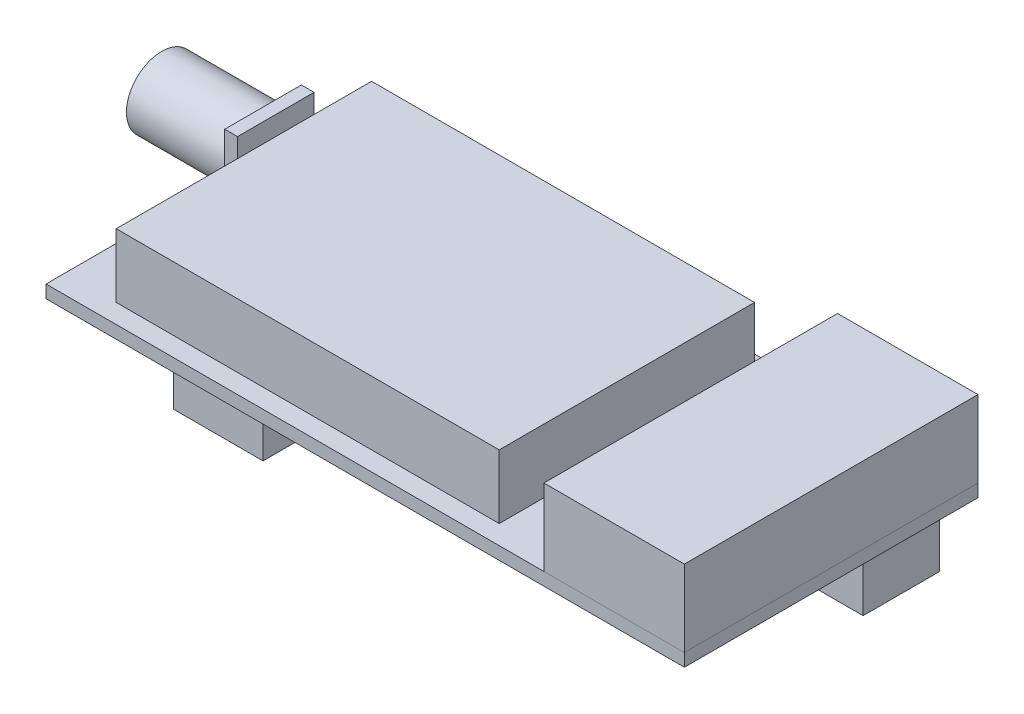
ISO-10303-21;
HEADER;
FILE_DESCRIPTION(('STEP AP214'),'2;1');
FILE_NAME('part.step','',(''),(''),'','','');
FILE_SCHEMA(('AUTOMOTIVE_DESIGN { 1 0 10303 214 1 1 1 1 }'));
ENDSEC;
DATA;
#1=APPLICATION_CONTEXT('core data for automotive mechanical design processes');
#2=APPLICATION_PROTOCOL_DEFINITION('international standard','automotive_design',2000,#1);
#3=PRODUCT_CONTEXT('',#1,'mechanical');
#4=PRODUCT('Part','Part','',(#3));
#5=PRODUCT_RELATED_PRODUCT_CATEGORY('part','',(#4));
#6=PRODUCT_DEFINITION_FORMATION('','',#4);
#7=PRODUCT_DEFINITION_CONTEXT('part definition',#1,'design');
#8=PRODUCT_DEFINITION('design','',#6,#7);
#9=PRODUCT_DEFINITION_SHAPE('','',#8);
#10=(LENGTH_UNIT() NAMED_UNIT(*) SI_UNIT(.MILLI.,.METRE.));
#11=(NAMED_UNIT(*) PLANE_ANGLE_UNIT() SI_UNIT($,.RADIAN.));
#12=(NAMED_UNIT(*) SI_UNIT($,.STERADIAN.) SOLID_ANGLE_UNIT());
#13=UNCERTAINTY_MEASURE_WITH_UNIT(LENGTH_MEASURE(1.E-05),#10,'distance_accuracy_value','');
#14=(GEOMETRIC_REPRESENTATION_CONTEXT(3) GLOBAL_UNCERTAINTY_ASSIGNED_CONTEXT((#13)) GLOBAL_UNIT_ASSIGNED_CONTEXT((#10,
#11,#12)) REPRESENTATION_CONTEXT('',''));
#15=CARTESIAN_POINT('',(0.,0.,0.));
#16=DIRECTION('',(0.,0.,1.));
#17=DIRECTION('',(1.,0.,0.));
#18=AXIS2_PLACEMENT_3D('',#15,#16,#17);
#19=CARTESIAN_POINT('',(14.,6.5,-11.5));
#20=DIRECTION('',(1.,0.,0.));
#21=DIRECTION('',(0.,0.,-1.));
#22=AXIS2_PLACEMENT_3D('',#19,#20,#21);
#23=PLANE('',#22);
#24=DIRECTION('',(0.,0.,1.));
#25=VECTOR('',#24,1.);
#26=CARTESIAN_POINT('',(14.,0.5,-11.5));
#27=LINE('',#26,#25);
#28=CARTESIAN_POINT('',(14.,0.5,-11.5));
#29=VERTEX_POINT('',#28);
#30=CARTESIAN_POINT('',(14.,0.5,11.5));
#31=VERTEX_POINT('',#30);
#32=EDGE_CURVE('E104',#29,#31,#27,.T.);
#33=ORIENTED_EDGE('',*,*,#32,.T.);
#34=DIRECTION('',(0.,-1.,0.));
#35=VECTOR('',#34,1.);
#36=CARTESIAN_POINT('',(14.,6.5,11.5));
#37=LINE('',#36,#35);
#38=CARTESIAN_POINT('',(14.,6.5,11.5));
#39=VERTEX_POINT('',#38);
#40=EDGE_CURVE('E12',#39,#31,#37,.T.);
#41=ORIENTED_EDGE('',*,*,#40,.F.);
#42=DIRECTION('',(0.,0.,1.));
#43=VECTOR('',#42,1.);
#44=CARTESIAN_POINT('',(14.,6.5,-11.5));
#45=LINE('',#44,#43);
#46=CARTESIAN_POINT('',(14.,6.5,-11.5));
#47=VERTEX_POINT('',#46);
#48=EDGE_CURVE('E92',#47,#39,#45,.T.);
#49=ORIENTED_EDGE('',*,*,#48,.F.);
#50=DIRECTION('',(0.,-1.,0.));
#51=VECTOR('',#50,1.);
#52=CARTESIAN_POINT('',(14.,6.5,-11.5));
#53=LINE('',#52,#51);
#54=EDGE_CURVE('E100',#47,#29,#53,.T.);
#55=ORIENTED_EDGE('',*,*,#54,.T.);
#56=EDGE_LOOP('',(#33,#41,#49,#55));
#57=FACE_BOUND('',#56,.T.);
#58=ADVANCED_FACE('F41',(#57),#23,.F.);
#59=CARTESIAN_POINT('',(14.,6.5,11.5));
#60=DIRECTION('',(0.,0.,-1.));
#61=DIRECTION('',(-1.,0.,0.));
#62=AXIS2_PLACEMENT_3D('',#59,#60,#61);
#63=PLANE('',#62);
#64=DIRECTION('',(1.,0.,0.));
#65=VECTOR('',#64,1.);
#66=CARTESIAN_POINT('',(14.,0.5,11.5));
#67=LINE('',#66,#65);
#68=CARTESIAN_POINT('',(25.,0.5,11.5));
#69=VERTEX_POINT('',#68);
#70=EDGE_CURVE('E96',#31,#69,#67,.T.);
#71=ORIENTED_EDGE('',*,*,#70,.T.);
#72=DIRECTION('',(0.,-1.,0.));
#73=VECTOR('',#72,1.);
#74=CARTESIAN_POINT('',(25.,6.5,11.5));
#75=LINE('',#74,#73);
#76=CARTESIAN_POINT('',(25.,6.5,11.5));
#77=VERTEX_POINT('',#76);
#78=EDGE_CURVE('E49',#77,#69,#75,.T.);
#79=ORIENTED_EDGE('',*,*,#78,.F.);
#80=DIRECTION('',(1.,0.,0.));
#81=VECTOR('',#80,1.);
#82=CARTESIAN_POINT('',(14.,6.5,11.5));
#83=LINE('',#82,#81);
#84=EDGE_CURVE('E87',#39,#77,#83,.T.);
#85=ORIENTED_EDGE('',*,*,#84,.F.);
#86=ORIENTED_EDGE('',*,*,#40,.T.);
#87=EDGE_LOOP('',(#71,#79,#85,#86));
#88=FACE_BOUND('',#87,.T.);
#89=ADVANCED_FACE('F95',(#88),#63,.F.);
#90=CARTESIAN_POINT('',(25.,6.5,-11.5));
#91=DIRECTION('',(-1.,0.,0.));
#92=DIRECTION('',(0.,0.,1.));
#93=AXIS2_PLACEMENT_3D('',#90,#91,#92);
#94=PLANE('',#93);
#95=DIRECTION('',(0.,0.,-1.));
#96=VECTOR('',#95,1.);
#97=CARTESIAN_POINT('',(25.,0.5,-11.5));
#98=LINE('',#97,#96);
#99=CARTESIAN_POINT('',(25.,0.5,-11.5));
#100=VERTEX_POINT('',#99);
#101=EDGE_CURVE('E74',#69,#100,#98,.T.);
#102=ORIENTED_EDGE('',*,*,#101,.T.);
#103=DIRECTION('',(0.,-1.,0.));
#104=VECTOR('',#103,1.);
#105=CARTESIAN_POINT('',(25.,6.5,-11.5));
#106=LINE('',#105,#104);
#107=CARTESIAN_POINT('',(25.,6.5,-11.5));
#108=VERTEX_POINT('',#107);
#109=EDGE_CURVE('E97',#108,#100,#106,.T.);
#110=ORIENTED_EDGE('',*,*,#109,.F.);
#111=DIRECTION('',(0.,0.,-1.));
#112=VECTOR('',#111,1.);
#113=CARTESIAN_POINT('',(25.,6.5,-11.5));
#114=LINE('',#113,#112);
#115=EDGE_CURVE('E90',#77,#108,#114,.T.);
#116=ORIENTED_EDGE('',*,*,#115,.F.);
#117=ORIENTED_EDGE('',*,*,#78,.T.);
#118=EDGE_LOOP('',(#102,#110,#116,#117));
#119=FACE_BOUND('',#118,.T.);
#120=ADVANCED_FACE('F98',(#119),#94,.F.);
#121=CARTESIAN_POINT('',(14.,6.5,-11.5));
#122=DIRECTION('',(0.,0.,1.));
#123=DIRECTION('',(1.,0.,0.));
#124=AXIS2_PLACEMENT_3D('',#121,#122,#123);
#125=PLANE('',#124);
#126=DIRECTION('',(-1.,0.,0.));
#127=VECTOR('',#126,1.);
#128=CARTESIAN_POINT('',(14.,0.5,-11.5));
#129=LINE('',#128,#127);
#130=EDGE_CURVE('E80',#100,#29,#129,.T.);
#131=ORIENTED_EDGE('',*,*,#130,.T.);
#132=ORIENTED_EDGE('',*,*,#54,.F.);
#133=DIRECTION('',(-1.,0.,0.));
#134=VECTOR('',#133,1.);
#135=CARTESIAN_POINT('',(14.,6.5,-11.5));
#136=LINE('',#135,#134);
#137=EDGE_CURVE('E57',#108,#47,#136,.T.);
#138=ORIENTED_EDGE('',*,*,#137,.F.);
#139=ORIENTED_EDGE('',*,*,#109,.T.);
#140=EDGE_LOOP('',(#131,#132,#138,#139));
#141=FACE_BOUND('',#140,.T.);
#142=ADVANCED_FACE('F111',(#141),#125,.F.);
#143=CARTESIAN_POINT('',(0.,6.5,0.));
#144=DIRECTION('',(0.,1.,0.));
#145=DIRECTION('',(0.,0.,1.));
#146=AXIS2_PLACEMENT_3D('',#143,#144,#145);
#147=PLANE('',#146);
#148=ORIENTED_EDGE('',*,*,#48,.T.);
#149=ORIENTED_EDGE('',*,*,#84,.T.);
#150=ORIENTED_EDGE('',*,*,#115,.T.);
#151=ORIENTED_EDGE('',*,*,#137,.T.);
#152=EDGE_LOOP('',(#148,#149,#150,#151));
#153=FACE_BOUND('',#152,.T.);
#154=ADVANCED_FACE('F88',(#153),#147,.T.);
#155=CARTESIAN_POINT('',(0.,0.5,0.));
#156=DIRECTION('',(0.,1.,0.));
#157=DIRECTION('',(0.,0.,1.));
#158=AXIS2_PLACEMENT_3D('',#155,#156,#157);
#159=PLANE('',#158);
#160=ORIENTED_EDGE('',*,*,#32,.F.);
#161=ORIENTED_EDGE('',*,*,#130,.F.);
#162=ORIENTED_EDGE('',*,*,#101,.F.);
#163=ORIENTED_EDGE('',*,*,#70,.F.);
#164=EDGE_LOOP('',(#160,#161,#162,#163));
#165=FACE_BOUND('',#164,.T.);
#166=ADVANCED_FACE('F114',(#165),#159,.F.);
#167=CLOSED_SHELL('',(#58,#89,#120,#142,#154,#166));
#168=MANIFOLD_SOLID_BREP('B2',#167);
#169=CARTESIAN_POINT('',(-34.,0.,-6.55283899782688));
#170=DIRECTION('',(1.,0.,0.));
#171=DIRECTION('',(0.,0.,-1.));
#172=AXIS2_PLACEMENT_3D('',#169,#170,#171);
#173=CYLINDRICAL_SURFACE('',#172,2.75);
#174=CARTESIAN_POINT('',(-34.,0.,-6.55283899782688));
#175=DIRECTION('',(-1.,0.,0.));
#176=DIRECTION('',(0.,0.,1.));
#177=AXIS2_PLACEMENT_3D('',#174,#175,#176);
#178=CIRCLE('',#177,2.75);
#179=CARTESIAN_POINT('',(-34.,0.,-3.80283899782688));
#180=VERTEX_POINT('',#179);
#181=EDGE_CURVE('E40',#180,#180,#178,.T.);
#182=ORIENTED_EDGE('',*,*,#181,.F.);
#183=EDGE_LOOP('',(#182));
#184=FACE_BOUND('',#183,.T.);
#185=CARTESIAN_POINT('',(-26.,0.,-6.55283899782688));
#186=DIRECTION('',(-1.,0.,0.));
#187=DIRECTION('',(0.,0.,1.));
#188=AXIS2_PLACEMENT_3D('',#185,#186,#187);
#189=CIRCLE('',#188,2.75);
#190=CARTESIAN_POINT('',(-26.,0.,-3.80283899782688));
#191=VERTEX_POINT('',#190);
#192=EDGE_CURVE('E177',#191,#191,#189,.T.);
#193=ORIENTED_EDGE('',*,*,#192,.T.);
#194=EDGE_LOOP('',(#193));
#195=FACE_BOUND('',#194,.T.);
#196=ADVANCED_FACE('F174',(#184,#195),#173,.T.);
#197=CARTESIAN_POINT('',(-34.,0.,-6.55283899782688));
#198=DIRECTION('',(-1.,0.,0.));
#199=DIRECTION('',(0.,0.,1.));
#200=AXIS2_PLACEMENT_3D('',#197,#198,#199);
#201=PLANE('',#200);
#202=ORIENTED_EDGE('',*,*,#181,.T.);
#203=EDGE_LOOP('',(#202));
#204=FACE_BOUND('',#203,.T.);
#205=ADVANCED_FACE('F189',(#204),#201,.T.);
#206=CARTESIAN_POINT('',(-26.,0.,-6.55283899782688));
#207=DIRECTION('',(-1.,0.,0.));
#208=DIRECTION('',(0.,0.,1.));
#209=AXIS2_PLACEMENT_3D('',#206,#207,#208);
#210=PLANE('',#209);
#211=ORIENTED_EDGE('',*,*,#192,.F.);
#212=EDGE_LOOP('',(#211));
#213=FACE_BOUND('',#212,.T.);
#214=ADVANCED_FACE('F187',(#213),#210,.F.);
#215=CLOSED_SHELL('',(#196,#205,#214));
#216=MANIFOLD_SOLID_BREP('B6',#215);
#217=CARTESIAN_POINT('',(-26.,3.,-9.49999999999999));
#218=DIRECTION('',(0.,0.,1.));
#219=DIRECTION('',(1.,0.,0.));
#220=AXIS2_PLACEMENT_3D('',#217,#218,#219);
#221=PLANE('',#220);
#222=DIRECTION('',(0.,-1.,0.));
#223=VECTOR('',#222,1.);
#224=CARTESIAN_POINT('',(-25.,3.,-9.49999999999999));
#225=LINE('',#224,#223);
#226=CARTESIAN_POINT('',(-25.,3.,-9.49999999999999));
#227=VERTEX_POINT('',#226);
#228=CARTESIAN_POINT('',(-25.,-3.,-9.49999999999999));
#229=VERTEX_POINT('',#228);
#230=EDGE_CURVE('E287',#227,#229,#225,.T.);
#231=ORIENTED_EDGE('',*,*,#230,.T.);
#232=DIRECTION('',(1.,0.,0.));
#233=VECTOR('',#232,1.);
#234=CARTESIAN_POINT('',(-26.,-3.,-9.49999999999999));
#235=LINE('',#234,#233);
#236=CARTESIAN_POINT('',(-26.,-3.,-9.49999999999999));
#237=VERTEX_POINT('',#236);
#238=EDGE_CURVE('E172',#237,#229,#235,.T.);
#239=ORIENTED_EDGE('',*,*,#238,.F.);
#240=DIRECTION('',(0.,-1.,0.));
#241=VECTOR('',#240,1.);
#242=CARTESIAN_POINT('',(-26.,3.,-9.49999999999999));
#243=LINE('',#242,#241);
#244=CARTESIAN_POINT('',(-26.,3.,-9.49999999999999));
#245=VERTEX_POINT('',#244);
#246=EDGE_CURVE('E275',#245,#237,#243,.T.);
#247=ORIENTED_EDGE('',*,*,#246,.F.);
#248=DIRECTION('',(1.,0.,0.));
#249=VECTOR('',#248,1.);
#250=CARTESIAN_POINT('',(-26.,3.,-9.49999999999999));
#251=LINE('',#250,#249);
#252=EDGE_CURVE('E283',#245,#227,#251,.T.);
#253=ORIENTED_EDGE('',*,*,#252,.T.);
#254=EDGE_LOOP('',(#231,#239,#247,#253));
#255=FACE_BOUND('',#254,.T.);
#256=ADVANCED_FACE('F224',(#255),#221,.F.);
#257=CARTESIAN_POINT('',(-26.,-3.,-9.49999999999999));
#258=DIRECTION('',(0.,1.,0.));
#259=DIRECTION('',(0.,0.,1.));
#260=AXIS2_PLACEMENT_3D('',#257,#258,#259);
#261=PLANE('',#260);
#262=DIRECTION('',(0.,0.,1.));
#263=VECTOR('',#262,1.);
#264=CARTESIAN_POINT('',(-25.,-3.,-9.49999999999999));
#265=LINE('',#264,#263);
#266=CARTESIAN_POINT('',(-25.,-3.,-3.49999999999999));
#267=VERTEX_POINT('',#266);
#268=EDGE_CURVE('E279',#229,#267,#265,.T.);
#269=ORIENTED_EDGE('',*,*,#268,.T.);
#270=DIRECTION('',(1.,0.,0.));
#271=VECTOR('',#270,1.);
#272=CARTESIAN_POINT('',(-26.,-3.,-3.49999999999999));
#273=LINE('',#272,#271);
#274=CARTESIAN_POINT('',(-26.,-3.,-3.49999999999999));
#275=VERTEX_POINT('',#274);
#276=EDGE_CURVE('E232',#275,#267,#273,.T.);
#277=ORIENTED_EDGE('',*,*,#276,.F.);
#278=DIRECTION('',(0.,0.,1.));
#279=VECTOR('',#278,1.);
#280=CARTESIAN_POINT('',(-26.,-3.,-9.49999999999999));
#281=LINE('',#280,#279);
#282=EDGE_CURVE('E270',#237,#275,#281,.T.);
#283=ORIENTED_EDGE('',*,*,#282,.F.);
#284=ORIENTED_EDGE('',*,*,#238,.T.);
#285=EDGE_LOOP('',(#269,#277,#283,#284));
#286=FACE_BOUND('',#285,.T.);
#287=ADVANCED_FACE('F278',(#286),#261,.F.);
#288=CARTESIAN_POINT('',(-26.,3.,-3.49999999999999));
#289=DIRECTION('',(0.,0.,-1.));
#290=DIRECTION('',(-1.,0.,0.));
#291=AXIS2_PLACEMENT_3D('',#288,#289,#290);
#292=PLANE('',#291);
#293=DIRECTION('',(0.,1.,0.));
#294=VECTOR('',#293,1.);
#295=CARTESIAN_POINT('',(-25.,3.,-3.49999999999999));
#296=LINE('',#295,#294);
#297=CARTESIAN_POINT('',(-25.,3.,-3.49999999999999));
#298=VERTEX_POINT('',#297);
#299=EDGE_CURVE('E257',#267,#298,#296,.T.);
#300=ORIENTED_EDGE('',*,*,#299,.T.);
#301=DIRECTION('',(1.,0.,0.));
#302=VECTOR('',#301,1.);
#303=CARTESIAN_POINT('',(-26.,3.,-3.49999999999999));
#304=LINE('',#303,#302);
#305=CARTESIAN_POINT('',(-26.,3.,-3.49999999999999));
#306=VERTEX_POINT('',#305);
#307=EDGE_CURVE('E280',#306,#298,#304,.T.);
#308=ORIENTED_EDGE('',*,*,#307,.F.);
#309=DIRECTION('',(0.,1.,0.));
#310=VECTOR('',#309,1.);
#311=CARTESIAN_POINT('',(-26.,3.,-3.49999999999999));
#312=LINE('',#311,#310);
#313=EDGE_CURVE('E273',#275,#306,#312,.T.);
#314=ORIENTED_EDGE('',*,*,#313,.F.);
#315=ORIENTED_EDGE('',*,*,#276,.T.);
#316=EDGE_LOOP('',(#300,#308,#314,#315));
#317=FACE_BOUND('',#316,.T.);
#318=ADVANCED_FACE('F281',(#317),#292,.F.);
#319=CARTESIAN_POINT('',(-26.,3.,-9.49999999999999));
#320=DIRECTION('',(0.,-1.,0.));
#321=DIRECTION('',(0.,0.,-1.));
#322=AXIS2_PLACEMENT_3D('',#319,#320,#321);
#323=PLANE('',#322);
#324=DIRECTION('',(0.,0.,-1.));
#325=VECTOR('',#324,1.);
#326=CARTESIAN_POINT('',(-25.,3.,-9.49999999999999));
#327=LINE('',#326,#325);
#328=EDGE_CURVE('E263',#298,#227,#327,.T.);
#329=ORIENTED_EDGE('',*,*,#328,.T.);
#330=ORIENTED_EDGE('',*,*,#252,.F.);
#331=DIRECTION('',(0.,0.,-1.));
#332=VECTOR('',#331,1.);
#333=CARTESIAN_POINT('',(-26.,3.,-9.49999999999999));
#334=LINE('',#333,#332);
#335=EDGE_CURVE('E240',#306,#245,#334,.T.);
#336=ORIENTED_EDGE('',*,*,#335,.F.);
#337=ORIENTED_EDGE('',*,*,#307,.T.);
#338=EDGE_LOOP('',(#329,#330,#336,#337));
#339=FACE_BOUND('',#338,.T.);
#340=ADVANCED_FACE('F294',(#339),#323,.F.);
#341=CARTESIAN_POINT('',(-26.,0.,0.));
#342=DIRECTION('',(-1.,0.,0.));
#343=DIRECTION('',(0.,0.,1.));
#344=AXIS2_PLACEMENT_3D('',#341,#342,#343);
#345=PLANE('',#344);
#346=ORIENTED_EDGE('',*,*,#246,.T.);
#347=ORIENTED_EDGE('',*,*,#282,.T.);
#348=ORIENTED_EDGE('',*,*,#313,.T.);
#349=ORIENTED_EDGE('',*,*,#335,.T.);
#350=EDGE_LOOP('',(#346,#347,#348,#349));
#351=FACE_BOUND('',#350,.T.);
#352=ADVANCED_FACE('F271',(#351),#345,.T.);
#353=CARTESIAN_POINT('',(-25.,0.,0.));
#354=DIRECTION('',(-1.,0.,0.));
#355=DIRECTION('',(0.,0.,1.));
#356=AXIS2_PLACEMENT_3D('',#353,#354,#355);
#357=PLANE('',#356);
#358=ORIENTED_EDGE('',*,*,#230,.F.);
#359=ORIENTED_EDGE('',*,*,#328,.F.);
#360=ORIENTED_EDGE('',*,*,#299,.F.);
#361=ORIENTED_EDGE('',*,*,#268,.F.);
#362=EDGE_LOOP('',(#358,#359,#360,#361));
#363=FACE_BOUND('',#362,.T.);
#364=ADVANCED_FACE('F297',(#363),#357,.F.);
#365=CLOSED_SHELL('',(#256,#287,#318,#340,#352,#364));
#366=MANIFOLD_SOLID_BREP('B35',#365);
#367=CARTESIAN_POINT('',(20.,-5.,-3.5));
#368=DIRECTION('',(1.,0.,0.));
#369=DIRECTION('',(0.,0.,-1.));
#370=AXIS2_PLACEMENT_3D('',#367,#368,#369);
#371=PLANE('',#370);
#372=DIRECTION('',(0.,0.,-1.));
#373=VECTOR('',#372,1.);
#374=CARTESIAN_POINT('',(20.,-0.5,-3.5));
#375=LINE('',#374,#373);
#376=CARTESIAN_POINT('',(20.,-0.5,-3.5));
#377=VERTEX_POINT('',#376);
#378=CARTESIAN_POINT('',(20.,-0.5,-9.5));
#379=VERTEX_POINT('',#378);
#380=EDGE_CURVE('E420',#377,#379,#375,.T.);
#381=ORIENTED_EDGE('',*,*,#380,.T.);
#382=DIRECTION('',(0.,1.,0.));
#383=VECTOR('',#382,1.);
#384=CARTESIAN_POINT('',(20.,-5.,-9.5));
#385=LINE('',#384,#383);
#386=CARTESIAN_POINT('',(20.,-5.,-9.5));
#387=VERTEX_POINT('',#386);
#388=EDGE_CURVE('E222',#387,#379,#385,.T.);
#389=ORIENTED_EDGE('',*,*,#388,.F.);
#390=DIRECTION('',(0.,0.,-1.));
#391=VECTOR('',#390,1.);
#392=CARTESIAN_POINT('',(20.,-5.,-3.5));
#393=LINE('',#392,#391);
#394=CARTESIAN_POINT('',(20.,-5.,-3.5));
#395=VERTEX_POINT('',#394);
#396=EDGE_CURVE('E408',#395,#387,#393,.T.);
#397=ORIENTED_EDGE('',*,*,#396,.F.);
#398=DIRECTION('',(0.,1.,0.));
#399=VECTOR('',#398,1.);
#400=CARTESIAN_POINT('',(20.,-5.,-3.5));
#401=LINE('',#400,#399);
#402=EDGE_CURVE('E416',#395,#377,#401,.T.);
#403=ORIENTED_EDGE('',*,*,#402,.T.);
#404=EDGE_LOOP('',(#381,#389,#397,#403));
#405=FACE_BOUND('',#404,.T.);
#406=ADVANCED_FACE('F357',(#405),#371,.F.);
#407=CARTESIAN_POINT('',(20.,-5.,-9.5));
#408=DIRECTION('',(0.,0.,1.));
#409=DIRECTION('',(1.,0.,0.));
#410=AXIS2_PLACEMENT_3D('',#407,#408,#409);
#411=PLANE('',#410);
#412=DIRECTION('',(1.,0.,0.));
#413=VECTOR('',#412,1.);
#414=CARTESIAN_POINT('',(20.,-0.5,-9.5));
#415=LINE('',#414,#413);
#416=CARTESIAN_POINT('',(24.,-0.5,-9.5));
#417=VERTEX_POINT('',#416);
#418=EDGE_CURVE('E412',#379,#417,#415,.T.);
#419=ORIENTED_EDGE('',*,*,#418,.T.);
#420=DIRECTION('',(0.,1.,0.));
#421=VECTOR('',#420,1.);
#422=CARTESIAN_POINT('',(24.,-5.,-9.5));
#423=LINE('',#422,#421);
#424=CARTESIAN_POINT('',(24.,-5.,-9.5));
#425=VERTEX_POINT('',#424);
#426=EDGE_CURVE('E365',#425,#417,#423,.T.);
#427=ORIENTED_EDGE('',*,*,#426,.F.);
#428=DIRECTION('',(1.,0.,0.));
#429=VECTOR('',#428,1.);
#430=CARTESIAN_POINT('',(20.,-5.,-9.5));
#431=LINE('',#430,#429);
#432=EDGE_CURVE('E403',#387,#425,#431,.T.);
#433=ORIENTED_EDGE('',*,*,#432,.F.);
#434=ORIENTED_EDGE('',*,*,#388,.T.);
#435=EDGE_LOOP('',(#419,#427,#433,#434));
#436=FACE_BOUND('',#435,.T.);
#437=ADVANCED_FACE('F411',(#436),#411,.F.);
#438=CARTESIAN_POINT('',(24.,-5.,-3.5));
#439=DIRECTION('',(-1.,0.,0.));
#440=DIRECTION('',(0.,0.,1.));
#441=AXIS2_PLACEMENT_3D('',#438,#439,#440);
#442=PLANE('',#441);
#443=DIRECTION('',(0.,0.,1.));
#444=VECTOR('',#443,1.);
#445=CARTESIAN_POINT('',(24.,-0.5,-3.5));
#446=LINE('',#445,#444);
#447=CARTESIAN_POINT('',(24.,-0.5,-3.5));
#448=VERTEX_POINT('',#447);
#449=EDGE_CURVE('E390',#417,#448,#446,.T.);
#450=ORIENTED_EDGE('',*,*,#449,.T.);
#451=DIRECTION('',(0.,1.,0.));
#452=VECTOR('',#451,1.);
#453=CARTESIAN_POINT('',(24.,-5.,-3.5));
#454=LINE('',#453,#452);
#455=CARTESIAN_POINT('',(24.,-5.,-3.5));
#456=VERTEX_POINT('',#455);
#457=EDGE_CURVE('E413',#456,#448,#454,.T.);
#458=ORIENTED_EDGE('',*,*,#457,.F.);
#459=DIRECTION('',(0.,0.,1.));
#460=VECTOR('',#459,1.);
#461=CARTESIAN_POINT('',(24.,-5.,-3.5));
#462=LINE('',#461,#460);
#463=EDGE_CURVE('E406',#425,#456,#462,.T.);
#464=ORIENTED_EDGE('',*,*,#463,.F.);
#465=ORIENTED_EDGE('',*,*,#426,.T.);
#466=EDGE_LOOP('',(#450,#458,#464,#465));
#467=FACE_BOUND('',#466,.T.);
#468=ADVANCED_FACE('F414',(#467),#442,.F.);
#469=CARTESIAN_POINT('',(20.,-5.,-3.5));
#470=DIRECTION('',(0.,0.,-1.));
#471=DIRECTION('',(-1.,0.,0.));
#472=AXIS2_PLACEMENT_3D('',#469,#470,#471);
#473=PLANE('',#472);
#474=DIRECTION('',(-1.,0.,0.));
#475=VECTOR('',#474,1.);
#476=CARTESIAN_POINT('',(20.,-0.5,-3.5));
#477=LINE('',#476,#475);
#478=EDGE_CURVE('E396',#448,#377,#477,.T.);
#479=ORIENTED_EDGE('',*,*,#478,.T.);
#480=ORIENTED_EDGE('',*,*,#402,.F.);
#481=DIRECTION('',(-1.,0.,0.));
#482=VECTOR('',#481,1.);
#483=CARTESIAN_POINT('',(20.,-5.,-3.5));
#484=LINE('',#483,#482);
#485=EDGE_CURVE('E373',#456,#395,#484,.T.);
#486=ORIENTED_EDGE('',*,*,#485,.F.);
#487=ORIENTED_EDGE('',*,*,#457,.T.);
#488=EDGE_LOOP('',(#479,#480,#486,#487));
#489=FACE_BOUND('',#488,.T.);
#490=ADVANCED_FACE('F427',(#489),#473,.F.);
#491=CARTESIAN_POINT('',(0.,-5.,0.));
#492=DIRECTION('',(0.,-1.,0.));
#493=DIRECTION('',(0.,0.,-1.));
#494=AXIS2_PLACEMENT_3D('',#491,#492,#493);
#495=PLANE('',#494);
#496=ORIENTED_EDGE('',*,*,#396,.T.);
#497=ORIENTED_EDGE('',*,*,#432,.T.);
#498=ORIENTED_EDGE('',*,*,#463,.T.);
#499=ORIENTED_EDGE('',*,*,#485,.T.);
#500=EDGE_LOOP('',(#496,#497,#498,#499));
#501=FACE_BOUND('',#500,.T.);
#502=ADVANCED_FACE('F404',(#501),#495,.T.);
#503=CARTESIAN_POINT('',(0.,-0.5,0.));
#504=DIRECTION('',(0.,-1.,0.));
#505=DIRECTION('',(0.,0.,-1.));
#506=AXIS2_PLACEMENT_3D('',#503,#504,#505);
#507=PLANE('',#506);
#508=ORIENTED_EDGE('',*,*,#380,.F.);
#509=ORIENTED_EDGE('',*,*,#478,.F.);
#510=ORIENTED_EDGE('',*,*,#449,.F.);
#511=ORIENTED_EDGE('',*,*,#418,.F.);
#512=EDGE_LOOP('',(#508,#509,#510,#511));
#513=FACE_BOUND('',#512,.T.);
#514=ADVANCED_FACE('F430',(#513),#507,.F.);
#515=CLOSED_SHELL('',(#406,#437,#468,#490,#502,#514));
#516=MANIFOLD_SOLID_BREP('B166',#515);
#517=CARTESIAN_POINT('',(-17.,-5.,9.50000000000001));
#518=DIRECTION('',(1.,0.,0.));
#519=DIRECTION('',(0.,0.,-1.));
#520=AXIS2_PLACEMENT_3D('',#517,#518,#519);
#521=PLANE('',#520);
#522=DIRECTION('',(0.,0.,-1.));
#523=VECTOR('',#522,1.);
#524=CARTESIAN_POINT('',(-17.,-0.5,9.50000000000001));
#525=LINE('',#524,#523);
#526=CARTESIAN_POINT('',(-17.,-0.5,9.50000000000001));
#527=VERTEX_POINT('',#526);
#528=CARTESIAN_POINT('',(-17.,-0.5,2.50000000000001));
#529=VERTEX_POINT('',#528);
#530=EDGE_CURVE('E553',#527,#529,#525,.T.);
#531=ORIENTED_EDGE('',*,*,#530,.T.);
#532=DIRECTION('',(0.,1.,0.));
#533=VECTOR('',#532,1.);
#534=CARTESIAN_POINT('',(-17.,-5.,2.50000000000001));
#535=LINE('',#534,#533);
#536=CARTESIAN_POINT('',(-17.,-5.,2.50000000000001));
#537=VERTEX_POINT('',#536);
#538=EDGE_CURVE('E355',#537,#529,#535,.T.);
#539=ORIENTED_EDGE('',*,*,#538,.F.);
#540=DIRECTION('',(0.,0.,-1.));
#541=VECTOR('',#540,1.);
#542=CARTESIAN_POINT('',(-17.,-5.,9.50000000000001));
#543=LINE('',#542,#541);
#544=CARTESIAN_POINT('',(-17.,-5.,9.50000000000001));
#545=VERTEX_POINT('',#544);
#546=EDGE_CURVE('E541',#545,#537,#543,.T.);
#547=ORIENTED_EDGE('',*,*,#546,.F.);
#548=DIRECTION('',(0.,1.,0.));
#549=VECTOR('',#548,1.);
#550=CARTESIAN_POINT('',(-17.,-5.,9.50000000000001));
#551=LINE('',#550,#549);
#552=EDGE_CURVE('E549',#545,#527,#551,.T.);
#553=ORIENTED_EDGE('',*,*,#552,.T.);
#554=EDGE_LOOP('',(#531,#539,#547,#553));
#555=FACE_BOUND('',#554,.T.);
#556=ADVANCED_FACE('F490',(#555),#521,.F.);
#557=CARTESIAN_POINT('',(-17.,-5.,2.50000000000001));
#558=DIRECTION('',(0.,0.,1.));
#559=DIRECTION('',(1.,0.,0.));
#560=AXIS2_PLACEMENT_3D('',#557,#558,#559);
#561=PLANE('',#560);
#562=DIRECTION('',(1.,0.,0.));
#563=VECTOR('',#562,1.);
#564=CARTESIAN_POINT('',(-17.,-0.5,2.50000000000001));
#565=LINE('',#564,#563);
#566=CARTESIAN_POINT('',(-10.,-0.5,2.50000000000001));
#567=VERTEX_POINT('',#566);
#568=EDGE_CURVE('E545',#529,#567,#565,.T.);
#569=ORIENTED_EDGE('',*,*,#568,.T.);
#570=DIRECTION('',(0.,1.,0.));
#571=VECTOR('',#570,1.);
#572=CARTESIAN_POINT('',(-10.,-5.,2.50000000000001));
#573=LINE('',#572,#571);
#574=CARTESIAN_POINT('',(-10.,-5.,2.50000000000001));
#575=VERTEX_POINT('',#574);
#576=EDGE_CURVE('E498',#575,#567,#573,.T.);
#577=ORIENTED_EDGE('',*,*,#576,.F.);
#578=DIRECTION('',(1.,0.,0.));
#579=VECTOR('',#578,1.);
#580=CARTESIAN_POINT('',(-17.,-5.,2.50000000000001));
#581=LINE('',#580,#579);
#582=EDGE_CURVE('E536',#537,#575,#581,.T.);
#583=ORIENTED_EDGE('',*,*,#582,.F.);
#584=ORIENTED_EDGE('',*,*,#538,.T.);
#585=EDGE_LOOP('',(#569,#577,#583,#584));
#586=FACE_BOUND('',#585,.T.);
#587=ADVANCED_FACE('F544',(#586),#561,.F.);
#588=CARTESIAN_POINT('',(-10.,-5.,9.50000000000001));
#589=DIRECTION('',(-1.,0.,0.));
#590=DIRECTION('',(0.,0.,1.));
#591=AXIS2_PLACEMENT_3D('',#588,#589,#590);
#592=PLANE('',#591);
#593=DIRECTION('',(0.,0.,1.));
#594=VECTOR('',#593,1.);
#595=CARTESIAN_POINT('',(-10.,-0.5,9.50000000000001));
#596=LINE('',#595,#594);
#597=CARTESIAN_POINT('',(-10.,-0.5,9.50000000000001));
#598=VERTEX_POINT('',#597);
#599=EDGE_CURVE('E523',#567,#598,#596,.T.);
#600=ORIENTED_EDGE('',*,*,#599,.T.);
#601=DIRECTION('',(0.,1.,0.));
#602=VECTOR('',#601,1.);
#603=CARTESIAN_POINT('',(-10.,-5.,9.50000000000001));
#604=LINE('',#603,#602);
#605=CARTESIAN_POINT('',(-10.,-5.,9.50000000000001));
#606=VERTEX_POINT('',#605);
#607=EDGE_CURVE('E546',#606,#598,#604,.T.);
#608=ORIENTED_EDGE('',*,*,#607,.F.);
#609=DIRECTION('',(0.,0.,1.));
#610=VECTOR('',#609,1.);
#611=CARTESIAN_POINT('',(-10.,-5.,9.50000000000001));
#612=LINE('',#611,#610);
#613=EDGE_CURVE('E539',#575,#606,#612,.T.);
#614=ORIENTED_EDGE('',*,*,#613,.F.);
#615=ORIENTED_EDGE('',*,*,#576,.T.);
#616=EDGE_LOOP('',(#600,#608,#614,#615));
#617=FACE_BOUND('',#616,.T.);
#618=ADVANCED_FACE('F547',(#617),#592,.F.);
#619=CARTESIAN_POINT('',(-17.,-5.,9.50000000000001));
#620=DIRECTION('',(0.,0.,-1.));
#621=DIRECTION('',(-1.,0.,0.));
#622=AXIS2_PLACEMENT_3D('',#619,#620,#621);
#623=PLANE('',#622);
#624=DIRECTION('',(-1.,0.,0.));
#625=VECTOR('',#624,1.);
#626=CARTESIAN_POINT('',(-17.,-0.5,9.50000000000001));
#627=LINE('',#626,#625);
#628=EDGE_CURVE('E529',#598,#527,#627,.T.);
#629=ORIENTED_EDGE('',*,*,#628,.T.);
#630=ORIENTED_EDGE('',*,*,#552,.F.);
#631=DIRECTION('',(-1.,0.,0.));
#632=VECTOR('',#631,1.);
#633=CARTESIAN_POINT('',(-17.,-5.,9.50000000000001));
#634=LINE('',#633,#632);
#635=EDGE_CURVE('E506',#606,#545,#634,.T.);
#636=ORIENTED_EDGE('',*,*,#635,.F.);
#637=ORIENTED_EDGE('',*,*,#607,.T.);
#638=EDGE_LOOP('',(#629,#630,#636,#637));
#639=FACE_BOUND('',#638,.T.);
#640=ADVANCED_FACE('F560',(#639),#623,.F.);
#641=CARTESIAN_POINT('',(0.,-5.,0.));
#642=DIRECTION('',(0.,-1.,0.));
#643=DIRECTION('',(0.,0.,-1.));
#644=AXIS2_PLACEMENT_3D('',#641,#642,#643);
#645=PLANE('',#644);
#646=ORIENTED_EDGE('',*,*,#546,.T.);
#647=ORIENTED_EDGE('',*,*,#582,.T.);
#648=ORIENTED_EDGE('',*,*,#613,.T.);
#649=ORIENTED_EDGE('',*,*,#635,.T.);
#650=EDGE_LOOP('',(#646,#647,#648,#649));
#651=FACE_BOUND('',#650,.T.);
#652=ADVANCED_FACE('F537',(#651),#645,.T.);
#653=CARTESIAN_POINT('',(0.,-0.5,0.));
#654=DIRECTION('',(0.,-1.,0.));
#655=DIRECTION('',(0.,0.,-1.));
#656=AXIS2_PLACEMENT_3D('',#653,#654,#655);
#657=PLANE('',#656);
#658=ORIENTED_EDGE('',*,*,#530,.F.);
#659=ORIENTED_EDGE('',*,*,#628,.F.);
#660=ORIENTED_EDGE('',*,*,#599,.F.);
#661=ORIENTED_EDGE('',*,*,#568,.F.);
#662=EDGE_LOOP('',(#658,#659,#660,#661));
#663=FACE_BOUND('',#662,.T.);
#664=ADVANCED_FACE('F563',(#663),#657,.F.);
#665=CLOSED_SHELL('',(#556,#587,#618,#640,#652,#664));
#666=MANIFOLD_SOLID_BREP('B216',#665);
#667=CARTESIAN_POINT('',(-21.,5.5,-10.));
#668=DIRECTION('',(1.,0.,0.));
#669=DIRECTION('',(0.,0.,-1.));
#670=AXIS2_PLACEMENT_3D('',#667,#668,#669);
#671=PLANE('',#670);
#672=DIRECTION('',(0.,0.,1.));
#673=VECTOR('',#672,1.);
#674=CARTESIAN_POINT('',(-21.,0.5,-10.));
#675=LINE('',#674,#673);
#676=CARTESIAN_POINT('',(-21.,0.5,-10.));
#677=VERTEX_POINT('',#676);
#678=CARTESIAN_POINT('',(-21.,0.5,10.));
#679=VERTEX_POINT('',#678);
#680=EDGE_CURVE('E685',#677,#679,#675,.T.);
#681=ORIENTED_EDGE('',*,*,#680,.T.);
#682=DIRECTION('',(0.,-1.,0.));
#683=VECTOR('',#682,1.);
#684=CARTESIAN_POINT('',(-21.,5.5,10.));
#685=LINE('',#684,#683);
#686=CARTESIAN_POINT('',(-21.,5.5,10.));
#687=VERTEX_POINT('',#686);
#688=EDGE_CURVE('E488',#687,#679,#685,.T.);
#689=ORIENTED_EDGE('',*,*,#688,.F.);
#690=DIRECTION('',(0.,0.,1.));
#691=VECTOR('',#690,1.);
#692=CARTESIAN_POINT('',(-21.,5.5,-10.));
#693=LINE('',#692,#691);
#694=CARTESIAN_POINT('',(-21.,5.5,-10.));
#695=VERTEX_POINT('',#694);
#696=EDGE_CURVE('E673',#695,#687,#693,.T.);
#697=ORIENTED_EDGE('',*,*,#696,.F.);
#698=DIRECTION('',(0.,-1.,0.));
#699=VECTOR('',#698,1.);
#700=CARTESIAN_POINT('',(-21.,5.5,-10.));
#701=LINE('',#700,#699);
#702=EDGE_CURVE('E681',#695,#677,#701,.T.);
#703=ORIENTED_EDGE('',*,*,#702,.T.);
#704=EDGE_LOOP('',(#681,#689,#697,#703));
#705=FACE_BOUND('',#704,.T.);
#706=ADVANCED_FACE('F622',(#705),#671,.F.);
#707=CARTESIAN_POINT('',(-21.,5.5,10.));
#708=DIRECTION('',(0.,0.,-1.));
#709=DIRECTION('',(-1.,0.,0.));
#710=AXIS2_PLACEMENT_3D('',#707,#708,#709);
#711=PLANE('',#710);
#712=DIRECTION('',(1.,0.,0.));
#713=VECTOR('',#712,1.);
#714=CARTESIAN_POINT('',(-21.,0.5,10.));
#715=LINE('',#714,#713);
#716=CARTESIAN_POINT('',(9.,0.5,9.99999999999999));
#717=VERTEX_POINT('',#716);
#718=EDGE_CURVE('E677',#679,#717,#715,.T.);
#719=ORIENTED_EDGE('',*,*,#718,.T.);
#720=DIRECTION('',(0.,-1.,0.));
#721=VECTOR('',#720,1.);
#722=CARTESIAN_POINT('',(9.,5.5,9.99999999999999));
#723=LINE('',#722,#721);
#724=CARTESIAN_POINT('',(9.,5.5,9.99999999999999));
#725=VERTEX_POINT('',#724);
#726=EDGE_CURVE('E630',#725,#717,#723,.T.);
#727=ORIENTED_EDGE('',*,*,#726,.F.);
#728=DIRECTION('',(1.,0.,0.));
#729=VECTOR('',#728,1.);
#730=CARTESIAN_POINT('',(-21.,5.5,10.));
#731=LINE('',#730,#729);
#732=EDGE_CURVE('E668',#687,#725,#731,.T.);
#733=ORIENTED_EDGE('',*,*,#732,.F.);
#734=ORIENTED_EDGE('',*,*,#688,.T.);
#735=EDGE_LOOP('',(#719,#727,#733,#734));
#736=FACE_BOUND('',#735,.T.);
#737=ADVANCED_FACE('F676',(#736),#711,.F.);
#738=CARTESIAN_POINT('',(8.99999999999999,5.5,-10.));
#739=DIRECTION('',(-1.,0.,0.));
#740=DIRECTION('',(0.,0.,1.));
#741=AXIS2_PLACEMENT_3D('',#738,#739,#740);
#742=PLANE('',#741);
#743=DIRECTION('',(0.,0.,-1.));
#744=VECTOR('',#743,1.);
#745=CARTESIAN_POINT('',(8.99999999999999,0.5,-10.));
#746=LINE('',#745,#744);
#747=CARTESIAN_POINT('',(8.99999999999999,0.5,-10.));
#748=VERTEX_POINT('',#747);
#749=EDGE_CURVE('E655',#717,#748,#746,.T.);
#750=ORIENTED_EDGE('',*,*,#749,.T.);
#751=DIRECTION('',(0.,-1.,0.));
#752=VECTOR('',#751,1.);
#753=CARTESIAN_POINT('',(8.99999999999999,5.5,-10.));
#754=LINE('',#753,#752);
#755=CARTESIAN_POINT('',(8.99999999999999,5.5,-10.));
#756=VERTEX_POINT('',#755);
#757=EDGE_CURVE('E678',#756,#748,#754,.T.);
#758=ORIENTED_EDGE('',*,*,#757,.F.);
#759=DIRECTION('',(0.,0.,-1.));
#760=VECTOR('',#759,1.);
#761=CARTESIAN_POINT('',(8.99999999999999,5.5,-10.));
#762=LINE('',#761,#760);
#763=EDGE_CURVE('E671',#725,#756,#762,.T.);
#764=ORIENTED_EDGE('',*,*,#763,.F.);
#765=ORIENTED_EDGE('',*,*,#726,.T.);
#766=EDGE_LOOP('',(#750,#758,#764,#765));
#767=FACE_BOUND('',#766,.T.);
#768=ADVANCED_FACE('F679',(#767),#742,.F.);
#769=CARTESIAN_POINT('',(-21.,5.5,-10.));
#770=DIRECTION('',(0.,0.,1.));
#771=DIRECTION('',(1.,0.,0.));
#772=AXIS2_PLACEMENT_3D('',#769,#770,#771);
#773=PLANE('',#772);
#774=DIRECTION('',(-1.,0.,0.));
#775=VECTOR('',#774,1.);
#776=CARTESIAN_POINT('',(-21.,0.5,-10.));
#777=LINE('',#776,#775);
#778=EDGE_CURVE('E661',#748,#677,#777,.T.);
#779=ORIENTED_EDGE('',*,*,#778,.T.);
#780=ORIENTED_EDGE('',*,*,#702,.F.);
#781=DIRECTION('',(-1.,0.,0.));
#782=VECTOR('',#781,1.);
#783=CARTESIAN_POINT('',(-21.,5.5,-10.));
#784=LINE('',#783,#782);
#785=EDGE_CURVE('E638',#756,#695,#784,.T.);
#786=ORIENTED_EDGE('',*,*,#785,.F.);
#787=ORIENTED_EDGE('',*,*,#757,.T.);
#788=EDGE_LOOP('',(#779,#780,#786,#787));
#789=FACE_BOUND('',#788,.T.);
#790=ADVANCED_FACE('F692',(#789),#773,.F.);
#791=CARTESIAN_POINT('',(0.,5.5,0.));
#792=DIRECTION('',(0.,1.,0.));
#793=DIRECTION('',(0.,0.,1.));
#794=AXIS2_PLACEMENT_3D('',#791,#792,#793);
#795=PLANE('',#794);
#796=ORIENTED_EDGE('',*,*,#696,.T.);
#797=ORIENTED_EDGE('',*,*,#732,.T.);
#798=ORIENTED_EDGE('',*,*,#763,.T.);
#799=ORIENTED_EDGE('',*,*,#785,.T.);
#800=EDGE_LOOP('',(#796,#797,#798,#799));
#801=FACE_BOUND('',#800,.T.);
#802=ADVANCED_FACE('F669',(#801),#795,.T.);
#803=CARTESIAN_POINT('',(0.,0.5,0.));
#804=DIRECTION('',(0.,1.,0.));
#805=DIRECTION('',(0.,0.,1.));
#806=AXIS2_PLACEMENT_3D('',#803,#804,#805);
#807=PLANE('',#806);
#808=ORIENTED_EDGE('',*,*,#680,.F.);
#809=ORIENTED_EDGE('',*,*,#778,.F.);
#810=ORIENTED_EDGE('',*,*,#749,.F.);
#811=ORIENTED_EDGE('',*,*,#718,.F.);
#812=EDGE_LOOP('',(#808,#809,#810,#811));
#813=FACE_BOUND('',#812,.T.);
#814=ADVANCED_FACE('F695',(#813),#807,.F.);
#815=CLOSED_SHELL('',(#706,#737,#768,#790,#802,#814));
#816=MANIFOLD_SOLID_BREP('B349',#815);
#817=CARTESIAN_POINT('',(-25.,0.5,-11.5));
#818=DIRECTION('',(1.,0.,0.));
#819=DIRECTION('',(0.,0.,-1.));
#820=AXIS2_PLACEMENT_3D('',#817,#818,#819);
#821=PLANE('',#820);
#822=DIRECTION('',(0.,0.,1.));
#823=VECTOR('',#822,1.);
#824=CARTESIAN_POINT('',(-25.,-0.5,-11.5));
#825=LINE('',#824,#823);
#826=CARTESIAN_POINT('',(-25.,-0.5,-11.5));
#827=VERTEX_POINT('',#826);
#828=CARTESIAN_POINT('',(-25.,-0.5,11.5));
#829=VERTEX_POINT('',#828);
#830=EDGE_CURVE('E808',#827,#829,#825,.T.);
#831=ORIENTED_EDGE('',*,*,#830,.T.);
#832=DIRECTION('',(0.,-1.,0.));
#833=VECTOR('',#832,1.);
#834=CARTESIAN_POINT('',(-25.,0.5,11.5));
#835=LINE('',#834,#833);
#836=CARTESIAN_POINT('',(-25.,0.5,11.5));
#837=VERTEX_POINT('',#836);
#838=EDGE_CURVE('E620',#837,#829,#835,.T.);
#839=ORIENTED_EDGE('',*,*,#838,.F.);
#840=DIRECTION('',(0.,0.,1.));
#841=VECTOR('',#840,1.);
#842=CARTESIAN_POINT('',(-25.,0.5,-11.5));
#843=LINE('',#842,#841);
#844=CARTESIAN_POINT('',(-25.,0.5,-11.5));
#845=VERTEX_POINT('',#844);
#846=EDGE_CURVE('E796',#845,#837,#843,.T.);
#847=ORIENTED_EDGE('',*,*,#846,.F.);
#848=DIRECTION('',(0.,-1.,0.));
#849=VECTOR('',#848,1.);
#850=CARTESIAN_POINT('',(-25.,0.5,-11.5));
#851=LINE('',#850,#849);
#852=EDGE_CURVE('E804',#845,#827,#851,.T.);
#853=ORIENTED_EDGE('',*,*,#852,.T.);
#854=EDGE_LOOP('',(#831,#839,#847,#853));
#855=FACE_BOUND('',#854,.T.);
#856=ADVANCED_FACE('F745',(#855),#821,.F.);
#857=CARTESIAN_POINT('',(25.,0.5,11.5));
#858=DIRECTION('',(0.,0.,-1.));
#859=DIRECTION('',(-1.,0.,0.));
#860=AXIS2_PLACEMENT_3D('',#857,#858,#859);
#861=PLANE('',#860);
#862=DIRECTION('',(1.,0.,0.));
#863=VECTOR('',#862,1.);
#864=CARTESIAN_POINT('',(25.,-0.5,11.5));
#865=LINE('',#864,#863);
#866=CARTESIAN_POINT('',(25.,-0.5,11.5));
#867=VERTEX_POINT('',#866);
#868=EDGE_CURVE('E800',#829,#867,#865,.T.);
#869=ORIENTED_EDGE('',*,*,#868,.T.);
#870=DIRECTION('',(0.,-1.,0.));
#871=VECTOR('',#870,1.);
#872=CARTESIAN_POINT('',(25.,0.5,11.5));
#873=LINE('',#872,#871);
#874=CARTESIAN_POINT('',(25.,0.5,11.5));
#875=VERTEX_POINT('',#874);
#876=EDGE_CURVE('E753',#875,#867,#873,.T.);
#877=ORIENTED_EDGE('',*,*,#876,.F.);
#878=DIRECTION('',(1.,0.,0.));
#879=VECTOR('',#878,1.);
#880=CARTESIAN_POINT('',(25.,0.5,11.5));
#881=LINE('',#880,#879);
#882=EDGE_CURVE('E791',#837,#875,#881,.T.);
#883=ORIENTED_EDGE('',*,*,#882,.F.);
#884=ORIENTED_EDGE('',*,*,#838,.T.);
#885=EDGE_LOOP('',(#869,#877,#883,#884));
#886=FACE_BOUND('',#885,.T.);
#887=ADVANCED_FACE('F799',(#886),#861,.F.);
#888=CARTESIAN_POINT('',(25.,0.5,-11.5));
#889=DIRECTION('',(-1.,0.,0.));
#890=DIRECTION('',(0.,0.,1.));
#891=AXIS2_PLACEMENT_3D('',#888,#889,#890);
#892=PLANE('',#891);
#893=DIRECTION('',(0.,0.,-1.));
#894=VECTOR('',#893,1.);
#895=CARTESIAN_POINT('',(25.,-0.5,-11.5));
#896=LINE('',#895,#894);
#897=CARTESIAN_POINT('',(25.,-0.5,-11.5));
#898=VERTEX_POINT('',#897);
#899=EDGE_CURVE('E778',#867,#898,#896,.T.);
#900=ORIENTED_EDGE('',*,*,#899,.T.);
#901=DIRECTION('',(0.,-1.,0.));
#902=VECTOR('',#901,1.);
#903=CARTESIAN_POINT('',(25.,0.5,-11.5));
#904=LINE('',#903,#902);
#905=CARTESIAN_POINT('',(25.,0.5,-11.5));
#906=VERTEX_POINT('',#905);
#907=EDGE_CURVE('E801',#906,#898,#904,.T.);
#908=ORIENTED_EDGE('',*,*,#907,.F.);
#909=DIRECTION('',(0.,0.,-1.));
#910=VECTOR('',#909,1.);
#911=CARTESIAN_POINT('',(25.,0.5,-11.5));
#912=LINE('',#911,#910);
#913=EDGE_CURVE('E794',#875,#906,#912,.T.);
#914=ORIENTED_EDGE('',*,*,#913,.F.);
#915=ORIENTED_EDGE('',*,*,#876,.T.);
#916=EDGE_LOOP('',(#900,#908,#914,#915));
#917=FACE_BOUND('',#916,.T.);
#918=ADVANCED_FACE('F802',(#917),#892,.F.);
#919=CARTESIAN_POINT('',(25.,0.5,-11.5));
#920=DIRECTION('',(0.,0.,1.));
#921=DIRECTION('',(1.,0.,0.));
#922=AXIS2_PLACEMENT_3D('',#919,#920,#921);
#923=PLANE('',#922);
#924=DIRECTION('',(-1.,0.,0.));
#925=VECTOR('',#924,1.);
#926=CARTESIAN_POINT('',(25.,-0.5,-11.5));
#927=LINE('',#926,#925);
#928=EDGE_CURVE('E784',#898,#827,#927,.T.);
#929=ORIENTED_EDGE('',*,*,#928,.T.);
#930=ORIENTED_EDGE('',*,*,#852,.F.);
#931=DIRECTION('',(-1.,0.,0.));
#932=VECTOR('',#931,1.);
#933=CARTESIAN_POINT('',(25.,0.5,-11.5));
#934=LINE('',#933,#932);
#935=EDGE_CURVE('E761',#906,#845,#934,.T.);
#936=ORIENTED_EDGE('',*,*,#935,.F.);
#937=ORIENTED_EDGE('',*,*,#907,.T.);
#938=EDGE_LOOP('',(#929,#930,#936,#937));
#939=FACE_BOUND('',#938,.T.);
#940=ADVANCED_FACE('F815',(#939),#923,.F.);
#941=CARTESIAN_POINT('',(0.,0.5,0.));
#942=DIRECTION('',(0.,-1.,0.));
#943=DIRECTION('',(0.,0.,-1.));
#944=AXIS2_PLACEMENT_3D('',#941,#942,#943);
#945=PLANE('',#944);
#946=ORIENTED_EDGE('',*,*,#846,.T.);
#947=ORIENTED_EDGE('',*,*,#882,.T.);
#948=ORIENTED_EDGE('',*,*,#913,.T.);
#949=ORIENTED_EDGE('',*,*,#935,.T.);
#950=EDGE_LOOP('',(#946,#947,#948,#949));
#951=FACE_BOUND('',#950,.T.);
#952=ADVANCED_FACE('F792',(#951),#945,.F.);
#953=CARTESIAN_POINT('',(0.,-0.5,0.));
#954=DIRECTION('',(0.,-1.,0.));
#955=DIRECTION('',(0.,0.,-1.));
#956=AXIS2_PLACEMENT_3D('',#953,#954,#955);
#957=PLANE('',#956);
#958=ORIENTED_EDGE('',*,*,#830,.F.);
#959=ORIENTED_EDGE('',*,*,#928,.F.);
#960=ORIENTED_EDGE('',*,*,#899,.F.);
#961=ORIENTED_EDGE('',*,*,#868,.F.);
#962=EDGE_LOOP('',(#958,#959,#960,#961));
#963=FACE_BOUND('',#962,.T.);
#964=ADVANCED_FACE('F818',(#963),#957,.T.);
#965=CLOSED_SHELL('',(#856,#887,#918,#940,#952,#964));
#966=MANIFOLD_SOLID_BREP('B482',#965);
#967=ADVANCED_BREP_SHAPE_REPRESENTATION('',(#18,#168,#216,#366,#516,#666,#816,#966),#14);
#968=SHAPE_DEFINITION_REPRESENTATION(#9,#967);
ENDSEC;
END-ISO-10303-21;
